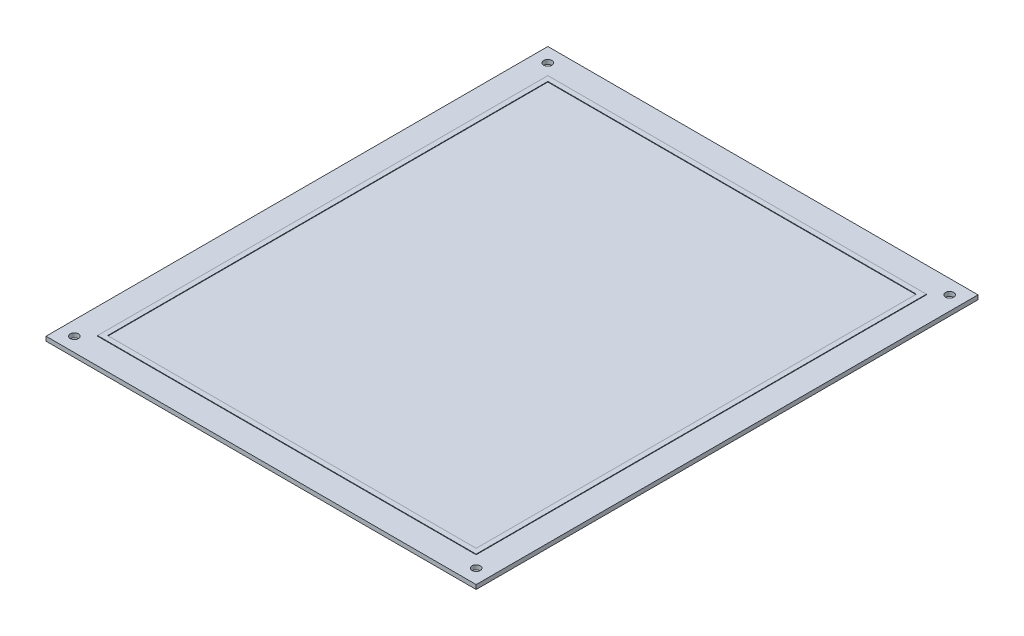
ISO-10303-21;
HEADER;
FILE_DESCRIPTION(('STEP AP214'),'2;1');
FILE_NAME('part.step','',(''),(''),'','','');
FILE_SCHEMA(('AUTOMOTIVE_DESIGN { 1 0 10303 214 1 1 1 1 }'));
ENDSEC;
DATA;
#1=APPLICATION_CONTEXT('core data for automotive mechanical design processes');
#2=APPLICATION_PROTOCOL_DEFINITION('international standard','automotive_design',2000,#1);
#3=PRODUCT_CONTEXT('',#1,'mechanical');
#4=PRODUCT('Part','Part','',(#3));
#5=PRODUCT_RELATED_PRODUCT_CATEGORY('part','',(#4));
#6=PRODUCT_DEFINITION_FORMATION('','',#4);
#7=PRODUCT_DEFINITION_CONTEXT('part definition',#1,'design');
#8=PRODUCT_DEFINITION('design','',#6,#7);
#9=PRODUCT_DEFINITION_SHAPE('','',#8);
#10=(LENGTH_UNIT() NAMED_UNIT(*) SI_UNIT(.MILLI.,.METRE.));
#11=(NAMED_UNIT(*) PLANE_ANGLE_UNIT() SI_UNIT($,.RADIAN.));
#12=(NAMED_UNIT(*) SI_UNIT($,.STERADIAN.) SOLID_ANGLE_UNIT());
#13=UNCERTAINTY_MEASURE_WITH_UNIT(LENGTH_MEASURE(1.E-05),#10,'distance_accuracy_value','');
#14=(GEOMETRIC_REPRESENTATION_CONTEXT(3) GLOBAL_UNCERTAINTY_ASSIGNED_CONTEXT((#13)) GLOBAL_UNIT_ASSIGNED_CONTEXT((#10,
#11,#12)) REPRESENTATION_CONTEXT('',''));
#15=CARTESIAN_POINT('',(0.,0.,0.));
#16=DIRECTION('',(0.,0.,1.));
#17=DIRECTION('',(1.,0.,0.));
#18=AXIS2_PLACEMENT_3D('',#15,#16,#17);
#19=CARTESIAN_POINT('',(0.,1.5,0.));
#20=DIRECTION('',(0.,-1.,0.));
#21=DIRECTION('',(0.,0.,-1.));
#22=AXIS2_PLACEMENT_3D('',#19,#20,#21);
#23=PLANE('',#22);
#24=DIRECTION('',(0.,0.,1.));
#25=VECTOR('',#24,1.);
#26=CARTESIAN_POINT('',(-150.,1.5,175.));
#27=LINE('',#26,#25);
#28=CARTESIAN_POINT('',(-150.,1.5,-175.));
#29=VERTEX_POINT('',#28);
#30=CARTESIAN_POINT('',(-150.,1.5,175.));
#31=VERTEX_POINT('',#30);
#32=EDGE_CURVE('E303',#29,#31,#27,.T.);
#33=ORIENTED_EDGE('',*,*,#32,.T.);
#34=DIRECTION('',(1.,0.,0.));
#35=VECTOR('',#34,1.);
#36=CARTESIAN_POINT('',(-150.,1.5,175.));
#37=LINE('',#36,#35);
#38=CARTESIAN_POINT('',(150.,1.5,175.));
#39=VERTEX_POINT('',#38);
#40=EDGE_CURVE('E306',#31,#39,#37,.T.);
#41=ORIENTED_EDGE('',*,*,#40,.T.);
#42=DIRECTION('',(0.,0.,-1.));
#43=VECTOR('',#42,1.);
#44=CARTESIAN_POINT('',(150.,1.5,175.));
#45=LINE('',#44,#43);
#46=CARTESIAN_POINT('',(150.,1.5,-175.));
#47=VERTEX_POINT('',#46);
#48=EDGE_CURVE('E309',#39,#47,#45,.T.);
#49=ORIENTED_EDGE('',*,*,#48,.T.);
#50=DIRECTION('',(-1.,0.,0.));
#51=VECTOR('',#50,1.);
#52=CARTESIAN_POINT('',(-150.,1.5,-175.));
#53=LINE('',#52,#51);
#54=EDGE_CURVE('E311',#47,#29,#53,.T.);
#55=ORIENTED_EDGE('',*,*,#54,.T.);
#56=EDGE_LOOP('',(#33,#41,#49,#55));
#57=FACE_BOUND('',#56,.T.);
#58=CARTESIAN_POINT('',(140.1,1.5,-165.1));
#59=DIRECTION('',(0.,1.,0.));
#60=DIRECTION('',(0.,0.,1.));
#61=AXIS2_PLACEMENT_3D('',#58,#59,#60);
#62=CIRCLE('',#61,2.88000000000001);
#63=CARTESIAN_POINT('',(140.1,1.5,-162.22));
#64=VERTEX_POINT('',#63);
#65=EDGE_CURVE('E297',#64,#64,#62,.T.);
#66=ORIENTED_EDGE('',*,*,#65,.F.);
#67=EDGE_LOOP('',(#66));
#68=FACE_BOUND('',#67,.T.);
#69=CARTESIAN_POINT('',(-140.1,1.5,-165.1));
#70=DIRECTION('',(0.,1.,0.));
#71=DIRECTION('',(0.,0.,1.));
#72=AXIS2_PLACEMENT_3D('',#69,#70,#71);
#73=CIRCLE('',#72,2.88000000000001);
#74=CARTESIAN_POINT('',(-140.1,1.5,-162.22));
#75=VERTEX_POINT('',#74);
#76=EDGE_CURVE('E291',#75,#75,#73,.T.);
#77=ORIENTED_EDGE('',*,*,#76,.F.);
#78=EDGE_LOOP('',(#77));
#79=FACE_BOUND('',#78,.T.);
#80=CARTESIAN_POINT('',(140.1,1.5,165.1));
#81=DIRECTION('',(0.,1.,0.));
#82=DIRECTION('',(0.,0.,1.));
#83=AXIS2_PLACEMENT_3D('',#80,#81,#82);
#84=CIRCLE('',#83,2.88000000000001);
#85=CARTESIAN_POINT('',(140.1,1.5,167.98));
#86=VERTEX_POINT('',#85);
#87=EDGE_CURVE('E285',#86,#86,#84,.T.);
#88=ORIENTED_EDGE('',*,*,#87,.F.);
#89=EDGE_LOOP('',(#88));
#90=FACE_BOUND('',#89,.T.);
#91=CARTESIAN_POINT('',(-140.1,1.5,165.1));
#92=DIRECTION('',(0.,1.,0.));
#93=DIRECTION('',(0.,0.,1.));
#94=AXIS2_PLACEMENT_3D('',#91,#92,#93);
#95=CIRCLE('',#94,2.88000000000001);
#96=CARTESIAN_POINT('',(-140.1,1.5,167.98));
#97=VERTEX_POINT('',#96);
#98=EDGE_CURVE('E279',#97,#97,#95,.T.);
#99=ORIENTED_EDGE('',*,*,#98,.F.);
#100=EDGE_LOOP('',(#99));
#101=FACE_BOUND('',#100,.T.);
#102=DIRECTION('',(0.,0.,1.));
#103=VECTOR('',#102,1.);
#104=CARTESIAN_POINT('',(-132.,1.5,0.));
#105=LINE('',#104,#103);
#106=CARTESIAN_POINT('',(-132.,1.5,-157.));
#107=VERTEX_POINT('',#106);
#108=CARTESIAN_POINT('',(-132.,1.5,157.));
#109=VERTEX_POINT('',#108);
#110=EDGE_CURVE('E276',#107,#109,#105,.T.);
#111=ORIENTED_EDGE('',*,*,#110,.F.);
#112=DIRECTION('',(-1.,0.,0.));
#113=VECTOR('',#112,1.);
#114=CARTESIAN_POINT('',(0.,1.5,-157.));
#115=LINE('',#114,#113);
#116=CARTESIAN_POINT('',(132.,1.5,-157.));
#117=VERTEX_POINT('',#116);
#118=EDGE_CURVE('E271',#117,#107,#115,.T.);
#119=ORIENTED_EDGE('',*,*,#118,.F.);
#120=DIRECTION('',(0.,0.,-1.));
#121=VECTOR('',#120,1.);
#122=CARTESIAN_POINT('',(132.,1.5,0.));
#123=LINE('',#122,#121);
#124=CARTESIAN_POINT('',(132.,1.5,157.));
#125=VERTEX_POINT('',#124);
#126=EDGE_CURVE('E59',#125,#117,#123,.T.);
#127=ORIENTED_EDGE('',*,*,#126,.F.);
#128=DIRECTION('',(1.,0.,0.));
#129=VECTOR('',#128,1.);
#130=CARTESIAN_POINT('',(0.,1.5,157.));
#131=LINE('',#130,#129);
#132=EDGE_CURVE('E54',#109,#125,#131,.T.);
#133=ORIENTED_EDGE('',*,*,#132,.F.);
#134=EDGE_LOOP('',(#111,#119,#127,#133));
#135=FACE_BOUND('',#134,.T.);
#136=ADVANCED_FACE('F39',(#57,#68,#79,#90,#101,#135),#23,.F.);
#137=CARTESIAN_POINT('',(0.,-1.5,0.));
#138=DIRECTION('',(0.,-1.,0.));
#139=DIRECTION('',(0.,0.,-1.));
#140=AXIS2_PLACEMENT_3D('',#137,#138,#139);
#141=PLANE('',#140);
#142=CARTESIAN_POINT('',(-140.1,-1.5,165.1));
#143=DIRECTION('',(0.,1.,0.));
#144=DIRECTION('',(0.,0.,1.));
#145=AXIS2_PLACEMENT_3D('',#142,#143,#144);
#146=CIRCLE('',#145,2.88000000000001);
#147=CARTESIAN_POINT('',(-140.1,-1.5,167.98));
#148=VERTEX_POINT('',#147);
#149=EDGE_CURVE('E278',#148,#148,#146,.T.);
#150=ORIENTED_EDGE('',*,*,#149,.T.);
#151=EDGE_LOOP('',(#150));
#152=FACE_BOUND('',#151,.T.);
#153=CARTESIAN_POINT('',(-140.1,-1.5,-165.1));
#154=DIRECTION('',(0.,1.,0.));
#155=DIRECTION('',(0.,0.,1.));
#156=AXIS2_PLACEMENT_3D('',#153,#154,#155);
#157=CIRCLE('',#156,2.88000000000001);
#158=CARTESIAN_POINT('',(-140.1,-1.5,-162.22));
#159=VERTEX_POINT('',#158);
#160=EDGE_CURVE('E288',#159,#159,#157,.T.);
#161=ORIENTED_EDGE('',*,*,#160,.T.);
#162=EDGE_LOOP('',(#161));
#163=FACE_BOUND('',#162,.T.);
#164=DIRECTION('',(0.,0.,1.));
#165=VECTOR('',#164,1.);
#166=CARTESIAN_POINT('',(-150.,-1.5,175.));
#167=LINE('',#166,#165);
#168=CARTESIAN_POINT('',(-150.,-1.5,-175.));
#169=VERTEX_POINT('',#168);
#170=CARTESIAN_POINT('',(-150.,-1.5,175.));
#171=VERTEX_POINT('',#170);
#172=EDGE_CURVE('E300',#169,#171,#167,.T.);
#173=ORIENTED_EDGE('',*,*,#172,.F.);
#174=DIRECTION('',(-1.,0.,0.));
#175=VECTOR('',#174,1.);
#176=CARTESIAN_POINT('',(-150.,-1.5,-175.));
#177=LINE('',#176,#175);
#178=CARTESIAN_POINT('',(150.,-1.5,-175.));
#179=VERTEX_POINT('',#178);
#180=EDGE_CURVE('E307',#179,#169,#177,.T.);
#181=ORIENTED_EDGE('',*,*,#180,.F.);
#182=DIRECTION('',(0.,0.,-1.));
#183=VECTOR('',#182,1.);
#184=CARTESIAN_POINT('',(150.,-1.5,175.));
#185=LINE('',#184,#183);
#186=CARTESIAN_POINT('',(150.,-1.5,175.));
#187=VERTEX_POINT('',#186);
#188=EDGE_CURVE('E318',#187,#179,#185,.T.);
#189=ORIENTED_EDGE('',*,*,#188,.F.);
#190=DIRECTION('',(1.,0.,0.));
#191=VECTOR('',#190,1.);
#192=CARTESIAN_POINT('',(-150.,-1.5,175.));
#193=LINE('',#192,#191);
#194=EDGE_CURVE('E316',#171,#187,#193,.T.);
#195=ORIENTED_EDGE('',*,*,#194,.F.);
#196=EDGE_LOOP('',(#173,#181,#189,#195));
#197=FACE_BOUND('',#196,.T.);
#198=CARTESIAN_POINT('',(140.1,-1.5,-165.1));
#199=DIRECTION('',(0.,1.,0.));
#200=DIRECTION('',(0.,0.,1.));
#201=AXIS2_PLACEMENT_3D('',#198,#199,#200);
#202=CIRCLE('',#201,2.88000000000001);
#203=CARTESIAN_POINT('',(140.1,-1.5,-162.22));
#204=VERTEX_POINT('',#203);
#205=EDGE_CURVE('E294',#204,#204,#202,.T.);
#206=ORIENTED_EDGE('',*,*,#205,.T.);
#207=EDGE_LOOP('',(#206));
#208=FACE_BOUND('',#207,.T.);
#209=CARTESIAN_POINT('',(140.1,-1.5,165.1));
#210=DIRECTION('',(0.,1.,0.));
#211=DIRECTION('',(0.,0.,1.));
#212=AXIS2_PLACEMENT_3D('',#209,#210,#211);
#213=CIRCLE('',#212,2.88000000000001);
#214=CARTESIAN_POINT('',(140.1,-1.5,167.98));
#215=VERTEX_POINT('',#214);
#216=EDGE_CURVE('E282',#215,#215,#213,.T.);
#217=ORIENTED_EDGE('',*,*,#216,.T.);
#218=EDGE_LOOP('',(#217));
#219=FACE_BOUND('',#218,.T.);
#220=DIRECTION('',(-1.,0.,0.));
#221=VECTOR('',#220,1.);
#222=CARTESIAN_POINT('',(0.,-1.5,-157.));
#223=LINE('',#222,#221);
#224=CARTESIAN_POINT('',(132.,-1.5,-157.));
#225=VERTEX_POINT('',#224);
#226=CARTESIAN_POINT('',(-132.,-1.5,-157.));
#227=VERTEX_POINT('',#226);
#228=EDGE_CURVE('E344',#225,#227,#223,.T.);
#229=ORIENTED_EDGE('',*,*,#228,.T.);
#230=DIRECTION('',(0.,0.,1.));
#231=VECTOR('',#230,1.);
#232=CARTESIAN_POINT('',(-132.,-1.5,0.));
#233=LINE('',#232,#231);
#234=CARTESIAN_POINT('',(-132.,-1.5,157.));
#235=VERTEX_POINT('',#234);
#236=EDGE_CURVE('E11',#227,#235,#233,.T.);
#237=ORIENTED_EDGE('',*,*,#236,.T.);
#238=DIRECTION('',(1.,0.,0.));
#239=VECTOR('',#238,1.);
#240=CARTESIAN_POINT('',(0.,-1.5,157.));
#241=LINE('',#240,#239);
#242=CARTESIAN_POINT('',(132.,-1.5,157.));
#243=VERTEX_POINT('',#242);
#244=EDGE_CURVE('E47',#235,#243,#241,.T.);
#245=ORIENTED_EDGE('',*,*,#244,.T.);
#246=DIRECTION('',(0.,0.,-1.));
#247=VECTOR('',#246,1.);
#248=CARTESIAN_POINT('',(132.,-1.5,0.));
#249=LINE('',#248,#247);
#250=EDGE_CURVE('E347',#243,#225,#249,.T.);
#251=ORIENTED_EDGE('',*,*,#250,.T.);
#252=EDGE_LOOP('',(#229,#237,#245,#251));
#253=FACE_BOUND('',#252,.T.);
#254=ADVANCED_FACE('F351',(#152,#163,#197,#208,#219,#253),#141,.T.);
#255=CARTESIAN_POINT('',(-150.,1.5,175.));
#256=DIRECTION('',(1.,0.,0.));
#257=DIRECTION('',(0.,0.,-1.));
#258=AXIS2_PLACEMENT_3D('',#255,#256,#257);
#259=PLANE('',#258);
#260=ORIENTED_EDGE('',*,*,#172,.T.);
#261=DIRECTION('',(0.,-1.,0.));
#262=VECTOR('',#261,1.);
#263=CARTESIAN_POINT('',(-150.,1.5,175.));
#264=LINE('',#263,#262);
#265=EDGE_CURVE('E329',#31,#171,#264,.T.);
#266=ORIENTED_EDGE('',*,*,#265,.F.);
#267=ORIENTED_EDGE('',*,*,#32,.F.);
#268=DIRECTION('',(0.,-1.,0.));
#269=VECTOR('',#268,1.);
#270=CARTESIAN_POINT('',(-150.,1.5,-175.));
#271=LINE('',#270,#269);
#272=EDGE_CURVE('E313',#29,#169,#271,.T.);
#273=ORIENTED_EDGE('',*,*,#272,.T.);
#274=EDGE_LOOP('',(#260,#266,#267,#273));
#275=FACE_BOUND('',#274,.T.);
#276=ADVANCED_FACE('F41',(#275),#259,.F.);
#277=CARTESIAN_POINT('',(-150.,1.5,175.));
#278=DIRECTION('',(0.,0.,-1.));
#279=DIRECTION('',(-1.,0.,0.));
#280=AXIS2_PLACEMENT_3D('',#277,#278,#279);
#281=PLANE('',#280);
#282=ORIENTED_EDGE('',*,*,#194,.T.);
#283=DIRECTION('',(0.,-1.,0.));
#284=VECTOR('',#283,1.);
#285=CARTESIAN_POINT('',(150.,1.5,175.));
#286=LINE('',#285,#284);
#287=EDGE_CURVE('E326',#39,#187,#286,.T.);
#288=ORIENTED_EDGE('',*,*,#287,.F.);
#289=ORIENTED_EDGE('',*,*,#40,.F.);
#290=ORIENTED_EDGE('',*,*,#265,.T.);
#291=EDGE_LOOP('',(#282,#288,#289,#290));
#292=FACE_BOUND('',#291,.T.);
#293=ADVANCED_FACE('F605',(#292),#281,.F.);
#294=CARTESIAN_POINT('',(150.,1.5,175.));
#295=DIRECTION('',(-1.,0.,0.));
#296=DIRECTION('',(0.,0.,1.));
#297=AXIS2_PLACEMENT_3D('',#294,#295,#296);
#298=PLANE('',#297);
#299=ORIENTED_EDGE('',*,*,#188,.T.);
#300=DIRECTION('',(0.,-1.,0.));
#301=VECTOR('',#300,1.);
#302=CARTESIAN_POINT('',(150.,1.5,-175.));
#303=LINE('',#302,#301);
#304=EDGE_CURVE('E323',#47,#179,#303,.T.);
#305=ORIENTED_EDGE('',*,*,#304,.F.);
#306=ORIENTED_EDGE('',*,*,#48,.F.);
#307=ORIENTED_EDGE('',*,*,#287,.T.);
#308=EDGE_LOOP('',(#299,#305,#306,#307));
#309=FACE_BOUND('',#308,.T.);
#310=ADVANCED_FACE('F596',(#309),#298,.F.);
#311=CARTESIAN_POINT('',(-150.,1.5,-175.));
#312=DIRECTION('',(0.,0.,1.));
#313=DIRECTION('',(1.,0.,0.));
#314=AXIS2_PLACEMENT_3D('',#311,#312,#313);
#315=PLANE('',#314);
#316=ORIENTED_EDGE('',*,*,#180,.T.);
#317=ORIENTED_EDGE('',*,*,#272,.F.);
#318=ORIENTED_EDGE('',*,*,#54,.F.);
#319=ORIENTED_EDGE('',*,*,#304,.T.);
#320=EDGE_LOOP('',(#316,#317,#318,#319));
#321=FACE_BOUND('',#320,.T.);
#322=ADVANCED_FACE('F588',(#321),#315,.F.);
#323=CARTESIAN_POINT('',(140.1,1.5,-165.1));
#324=DIRECTION('',(0.,-1.,0.));
#325=DIRECTION('',(0.,0.,-1.));
#326=AXIS2_PLACEMENT_3D('',#323,#324,#325);
#327=CYLINDRICAL_SURFACE('',#326,2.88000000000001);
#328=ORIENTED_EDGE('',*,*,#65,.T.);
#329=EDGE_LOOP('',(#328));
#330=FACE_BOUND('',#329,.T.);
#331=ORIENTED_EDGE('',*,*,#205,.F.);
#332=EDGE_LOOP('',(#331));
#333=FACE_BOUND('',#332,.T.);
#334=ADVANCED_FACE('F579',(#330,#333),#327,.F.);
#335=CARTESIAN_POINT('',(-140.1,1.5,-165.1));
#336=DIRECTION('',(0.,-1.,0.));
#337=DIRECTION('',(0.,0.,-1.));
#338=AXIS2_PLACEMENT_3D('',#335,#336,#337);
#339=CYLINDRICAL_SURFACE('',#338,2.88000000000001);
#340=ORIENTED_EDGE('',*,*,#76,.T.);
#341=EDGE_LOOP('',(#340));
#342=FACE_BOUND('',#341,.T.);
#343=ORIENTED_EDGE('',*,*,#160,.F.);
#344=EDGE_LOOP('',(#343));
#345=FACE_BOUND('',#344,.T.);
#346=ADVANCED_FACE('F570',(#342,#345),#339,.F.);
#347=CARTESIAN_POINT('',(140.1,1.5,165.1));
#348=DIRECTION('',(0.,-1.,0.));
#349=DIRECTION('',(0.,0.,-1.));
#350=AXIS2_PLACEMENT_3D('',#347,#348,#349);
#351=CYLINDRICAL_SURFACE('',#350,2.88000000000001);
#352=ORIENTED_EDGE('',*,*,#87,.T.);
#353=EDGE_LOOP('',(#352));
#354=FACE_BOUND('',#353,.T.);
#355=ORIENTED_EDGE('',*,*,#216,.F.);
#356=EDGE_LOOP('',(#355));
#357=FACE_BOUND('',#356,.T.);
#358=ADVANCED_FACE('F382',(#354,#357),#351,.F.);
#359=CARTESIAN_POINT('',(-140.1,1.5,165.1));
#360=DIRECTION('',(0.,-1.,0.));
#361=DIRECTION('',(0.,0.,-1.));
#362=AXIS2_PLACEMENT_3D('',#359,#360,#361);
#363=CYLINDRICAL_SURFACE('',#362,2.88000000000001);
#364=ORIENTED_EDGE('',*,*,#98,.T.);
#365=EDGE_LOOP('',(#364));
#366=FACE_BOUND('',#365,.T.);
#367=ORIENTED_EDGE('',*,*,#149,.F.);
#368=EDGE_LOOP('',(#367));
#369=FACE_BOUND('',#368,.T.);
#370=ADVANCED_FACE('F372',(#366,#369),#363,.F.);
#371=CARTESIAN_POINT('',(-132.,1.9,-157.));
#372=DIRECTION('',(0.,0.,1.));
#373=DIRECTION('',(1.,0.,0.));
#374=AXIS2_PLACEMENT_3D('',#371,#372,#373);
#375=PLANE('',#374);
#376=ORIENTED_EDGE('',*,*,#228,.F.);
#377=DIRECTION('',(0.,-1.,0.));
#378=VECTOR('',#377,1.);
#379=CARTESIAN_POINT('',(132.,1.9,-157.));
#380=LINE('',#379,#378);
#381=CARTESIAN_POINT('',(132.,-1.9,-157.));
#382=VERTEX_POINT('',#381);
#383=EDGE_CURVE('E250',#225,#382,#380,.T.);
#384=ORIENTED_EDGE('',*,*,#383,.T.);
#385=DIRECTION('',(-1.,0.,0.));
#386=VECTOR('',#385,1.);
#387=CARTESIAN_POINT('',(-132.,-1.9,-157.));
#388=LINE('',#387,#386);
#389=CARTESIAN_POINT('',(-132.,-1.9,-157.));
#390=VERTEX_POINT('',#389);
#391=EDGE_CURVE('E230',#382,#390,#388,.T.);
#392=ORIENTED_EDGE('',*,*,#391,.T.);
#393=DIRECTION('',(0.,-1.,0.));
#394=VECTOR('',#393,1.);
#395=CARTESIAN_POINT('',(-132.,1.9,-157.));
#396=LINE('',#395,#394);
#397=EDGE_CURVE('E236',#227,#390,#396,.T.);
#398=ORIENTED_EDGE('',*,*,#397,.F.);
#399=EDGE_LOOP('',(#376,#384,#392,#398));
#400=FACE_BOUND('',#399,.T.);
#401=ADVANCED_FACE('F370',(#400),#375,.F.);
#402=CARTESIAN_POINT('',(132.,1.9,157.));
#403=DIRECTION('',(-1.,0.,0.));
#404=DIRECTION('',(0.,0.,1.));
#405=AXIS2_PLACEMENT_3D('',#402,#403,#404);
#406=PLANE('',#405);
#407=ORIENTED_EDGE('',*,*,#250,.F.);
#408=DIRECTION('',(0.,-1.,0.));
#409=VECTOR('',#408,1.);
#410=CARTESIAN_POINT('',(132.,1.9,157.));
#411=LINE('',#410,#409);
#412=CARTESIAN_POINT('',(132.,-1.9,157.));
#413=VERTEX_POINT('',#412);
#414=EDGE_CURVE('E254',#243,#413,#411,.T.);
#415=ORIENTED_EDGE('',*,*,#414,.T.);
#416=DIRECTION('',(0.,0.,-1.));
#417=VECTOR('',#416,1.);
#418=CARTESIAN_POINT('',(132.,-1.9,157.));
#419=LINE('',#418,#417);
#420=EDGE_CURVE('E242',#413,#382,#419,.T.);
#421=ORIENTED_EDGE('',*,*,#420,.T.);
#422=ORIENTED_EDGE('',*,*,#383,.F.);
#423=EDGE_LOOP('',(#407,#415,#421,#422));
#424=FACE_BOUND('',#423,.T.);
#425=ADVANCED_FACE('F368',(#424),#406,.F.);
#426=CARTESIAN_POINT('',(-132.,1.9,157.));
#427=DIRECTION('',(0.,0.,-1.));
#428=DIRECTION('',(-1.,0.,0.));
#429=AXIS2_PLACEMENT_3D('',#426,#427,#428);
#430=PLANE('',#429);
#431=ORIENTED_EDGE('',*,*,#244,.F.);
#432=DIRECTION('',(0.,-1.,0.));
#433=VECTOR('',#432,1.);
#434=CARTESIAN_POINT('',(-132.,1.9,157.));
#435=LINE('',#434,#433);
#436=CARTESIAN_POINT('',(-132.,-1.9,157.));
#437=VERTEX_POINT('',#436);
#438=EDGE_CURVE('E258',#235,#437,#435,.T.);
#439=ORIENTED_EDGE('',*,*,#438,.T.);
#440=DIRECTION('',(1.,0.,0.));
#441=VECTOR('',#440,1.);
#442=CARTESIAN_POINT('',(-132.,-1.9,157.));
#443=LINE('',#442,#441);
#444=EDGE_CURVE('E239',#437,#413,#443,.T.);
#445=ORIENTED_EDGE('',*,*,#444,.T.);
#446=ORIENTED_EDGE('',*,*,#414,.F.);
#447=EDGE_LOOP('',(#431,#439,#445,#446));
#448=FACE_BOUND('',#447,.T.);
#449=ADVANCED_FACE('F356',(#448),#430,.F.);
#450=CARTESIAN_POINT('',(-132.,1.9,157.));
#451=DIRECTION('',(1.,0.,0.));
#452=DIRECTION('',(0.,0.,-1.));
#453=AXIS2_PLACEMENT_3D('',#450,#451,#452);
#454=PLANE('',#453);
#455=ORIENTED_EDGE('',*,*,#236,.F.);
#456=ORIENTED_EDGE('',*,*,#397,.T.);
#457=DIRECTION('',(0.,0.,1.));
#458=VECTOR('',#457,1.);
#459=CARTESIAN_POINT('',(-132.,-1.9,157.));
#460=LINE('',#459,#458);
#461=EDGE_CURVE('E194',#390,#437,#460,.T.);
#462=ORIENTED_EDGE('',*,*,#461,.T.);
#463=ORIENTED_EDGE('',*,*,#438,.F.);
#464=EDGE_LOOP('',(#455,#456,#462,#463));
#465=FACE_BOUND('',#464,.T.);
#466=ADVANCED_FACE('F359',(#465),#454,.F.);
#467=CARTESIAN_POINT('',(0.,-1.9,0.));
#468=DIRECTION('',(0.,-1.,0.));
#469=DIRECTION('',(0.,0.,-1.));
#470=AXIS2_PLACEMENT_3D('',#467,#468,#469);
#471=PLANE('',#470);
#472=ORIENTED_EDGE('',*,*,#461,.F.);
#473=ORIENTED_EDGE('',*,*,#391,.F.);
#474=ORIENTED_EDGE('',*,*,#420,.F.);
#475=ORIENTED_EDGE('',*,*,#444,.F.);
#476=EDGE_LOOP('',(#472,#473,#474,#475));
#477=FACE_BOUND('',#476,.T.);
#478=DIRECTION('',(-1.,0.,0.));
#479=VECTOR('',#478,1.);
#480=CARTESIAN_POINT('',(-128.5,-1.9,-153.5));
#481=LINE('',#480,#479);
#482=CARTESIAN_POINT('',(128.5,-1.9,-153.5));
#483=VERTEX_POINT('',#482);
#484=CARTESIAN_POINT('',(-128.5,-1.9,-153.5));
#485=VERTEX_POINT('',#484);
#486=EDGE_CURVE('E186',#483,#485,#481,.T.);
#487=ORIENTED_EDGE('',*,*,#486,.T.);
#488=DIRECTION('',(0.,0.,1.));
#489=VECTOR('',#488,1.);
#490=CARTESIAN_POINT('',(-128.5,-1.9,153.5));
#491=LINE('',#490,#489);
#492=CARTESIAN_POINT('',(-128.5,-1.9,153.5));
#493=VERTEX_POINT('',#492);
#494=EDGE_CURVE('E207',#485,#493,#491,.T.);
#495=ORIENTED_EDGE('',*,*,#494,.T.);
#496=DIRECTION('',(1.,0.,0.));
#497=VECTOR('',#496,1.);
#498=CARTESIAN_POINT('',(-128.5,-1.9,153.5));
#499=LINE('',#498,#497);
#500=CARTESIAN_POINT('',(128.5,-1.9,153.5));
#501=VERTEX_POINT('',#500);
#502=EDGE_CURVE('E210',#493,#501,#499,.T.);
#503=ORIENTED_EDGE('',*,*,#502,.T.);
#504=DIRECTION('',(0.,0.,-1.));
#505=VECTOR('',#504,1.);
#506=CARTESIAN_POINT('',(128.5,-1.9,153.5));
#507=LINE('',#506,#505);
#508=EDGE_CURVE('E213',#501,#483,#507,.T.);
#509=ORIENTED_EDGE('',*,*,#508,.T.);
#510=EDGE_LOOP('',(#487,#495,#503,#509));
#511=FACE_BOUND('',#510,.T.);
#512=ADVANCED_FACE('F363',(#477,#511),#471,.T.);
#513=CARTESIAN_POINT('',(-128.5,1.9,-153.5));
#514=DIRECTION('',(0.,0.,1.));
#515=DIRECTION('',(1.,0.,0.));
#516=AXIS2_PLACEMENT_3D('',#513,#514,#515);
#517=PLANE('',#516);
#518=DIRECTION('',(0.,-1.,0.));
#519=VECTOR('',#518,1.);
#520=CARTESIAN_POINT('',(128.5,1.9,-153.5));
#521=LINE('',#520,#519);
#522=CARTESIAN_POINT('',(128.5,-1.5,-153.5));
#523=VERTEX_POINT('',#522);
#524=EDGE_CURVE('E219',#523,#483,#521,.T.);
#525=ORIENTED_EDGE('',*,*,#524,.F.);
#526=DIRECTION('',(-1.,0.,0.));
#527=VECTOR('',#526,1.);
#528=CARTESIAN_POINT('',(0.,-1.5,-153.5));
#529=LINE('',#528,#527);
#530=CARTESIAN_POINT('',(-128.5,-1.5,-153.5));
#531=VERTEX_POINT('',#530);
#532=EDGE_CURVE('E332',#523,#531,#529,.T.);
#533=ORIENTED_EDGE('',*,*,#532,.T.);
#534=DIRECTION('',(0.,-1.,0.));
#535=VECTOR('',#534,1.);
#536=CARTESIAN_POINT('',(-128.5,1.9,-153.5));
#537=LINE('',#536,#535);
#538=EDGE_CURVE('E206',#531,#485,#537,.T.);
#539=ORIENTED_EDGE('',*,*,#538,.T.);
#540=ORIENTED_EDGE('',*,*,#486,.F.);
#541=EDGE_LOOP('',(#525,#533,#539,#540));
#542=FACE_BOUND('',#541,.T.);
#543=ADVANCED_FACE('F418',(#542),#517,.T.);
#544=CARTESIAN_POINT('',(128.5,1.9,153.5));
#545=DIRECTION('',(-1.,0.,0.));
#546=DIRECTION('',(0.,0.,1.));
#547=AXIS2_PLACEMENT_3D('',#544,#545,#546);
#548=PLANE('',#547);
#549=DIRECTION('',(0.,-1.,0.));
#550=VECTOR('',#549,1.);
#551=CARTESIAN_POINT('',(128.5,1.9,153.5));
#552=LINE('',#551,#550);
#553=CARTESIAN_POINT('',(128.5,-1.5,153.5));
#554=VERTEX_POINT('',#553);
#555=EDGE_CURVE('E223',#554,#501,#552,.T.);
#556=ORIENTED_EDGE('',*,*,#555,.F.);
#557=DIRECTION('',(0.,0.,-1.));
#558=VECTOR('',#557,1.);
#559=CARTESIAN_POINT('',(128.5,-1.5,0.));
#560=LINE('',#559,#558);
#561=EDGE_CURVE('E335',#554,#523,#560,.T.);
#562=ORIENTED_EDGE('',*,*,#561,.T.);
#563=ORIENTED_EDGE('',*,*,#524,.T.);
#564=ORIENTED_EDGE('',*,*,#508,.F.);
#565=EDGE_LOOP('',(#556,#562,#563,#564));
#566=FACE_BOUND('',#565,.T.);
#567=ADVANCED_FACE('F412',(#566),#548,.T.);
#568=CARTESIAN_POINT('',(-128.5,1.9,153.5));
#569=DIRECTION('',(0.,0.,-1.));
#570=DIRECTION('',(-1.,0.,0.));
#571=AXIS2_PLACEMENT_3D('',#568,#569,#570);
#572=PLANE('',#571);
#573=DIRECTION('',(0.,-1.,0.));
#574=VECTOR('',#573,1.);
#575=CARTESIAN_POINT('',(-128.5,1.9,153.5));
#576=LINE('',#575,#574);
#577=CARTESIAN_POINT('',(-128.5,-1.5,153.5));
#578=VERTEX_POINT('',#577);
#579=EDGE_CURVE('E195',#578,#493,#576,.T.);
#580=ORIENTED_EDGE('',*,*,#579,.F.);
#581=DIRECTION('',(1.,0.,0.));
#582=VECTOR('',#581,1.);
#583=CARTESIAN_POINT('',(0.,-1.5,153.5));
#584=LINE('',#583,#582);
#585=EDGE_CURVE('E338',#578,#554,#584,.T.);
#586=ORIENTED_EDGE('',*,*,#585,.T.);
#587=ORIENTED_EDGE('',*,*,#555,.T.);
#588=ORIENTED_EDGE('',*,*,#502,.F.);
#589=EDGE_LOOP('',(#580,#586,#587,#588));
#590=FACE_BOUND('',#589,.T.);
#591=ADVANCED_FACE('F420',(#590),#572,.T.);
#592=CARTESIAN_POINT('',(-128.5,1.9,153.5));
#593=DIRECTION('',(1.,0.,0.));
#594=DIRECTION('',(0.,0.,-1.));
#595=AXIS2_PLACEMENT_3D('',#592,#593,#594);
#596=PLANE('',#595);
#597=ORIENTED_EDGE('',*,*,#538,.F.);
#598=DIRECTION('',(0.,0.,1.));
#599=VECTOR('',#598,1.);
#600=CARTESIAN_POINT('',(-128.5,-1.5,0.));
#601=LINE('',#600,#599);
#602=EDGE_CURVE('E341',#531,#578,#601,.T.);
#603=ORIENTED_EDGE('',*,*,#602,.T.);
#604=ORIENTED_EDGE('',*,*,#579,.T.);
#605=ORIENTED_EDGE('',*,*,#494,.F.);
#606=EDGE_LOOP('',(#597,#603,#604,#605));
#607=FACE_BOUND('',#606,.T.);
#608=ADVANCED_FACE('F427',(#607),#596,.T.);
#609=ORIENTED_EDGE('',*,*,#602,.F.);
#610=ORIENTED_EDGE('',*,*,#532,.F.);
#611=ORIENTED_EDGE('',*,*,#561,.F.);
#612=ORIENTED_EDGE('',*,*,#585,.F.);
#613=EDGE_LOOP('',(#609,#610,#611,#612));
#614=FACE_BOUND('',#613,.T.);
#615=ADVANCED_FACE('F396',(#614),#141,.T.);
#616=CARTESIAN_POINT('',(-132.,1.9,-157.));
#617=VERTEX_POINT('',#616);
#618=EDGE_CURVE('E247',#617,#107,#396,.T.);
#619=ORIENTED_EDGE('',*,*,#618,.T.);
#620=ORIENTED_EDGE('',*,*,#110,.T.);
#621=CARTESIAN_POINT('',(-132.,1.9,157.));
#622=VERTEX_POINT('',#621);
#623=EDGE_CURVE('E259',#622,#109,#435,.T.);
#624=ORIENTED_EDGE('',*,*,#623,.F.);
#625=DIRECTION('',(0.,0.,1.));
#626=VECTOR('',#625,1.);
#627=CARTESIAN_POINT('',(-132.,1.9,157.));
#628=LINE('',#627,#626);
#629=EDGE_CURVE('E226',#617,#622,#628,.T.);
#630=ORIENTED_EDGE('',*,*,#629,.F.);
#631=EDGE_LOOP('',(#619,#620,#624,#630));
#632=FACE_BOUND('',#631,.T.);
#633=ADVANCED_FACE('F445',(#632),#454,.F.);
#634=ORIENTED_EDGE('',*,*,#623,.T.);
#635=ORIENTED_EDGE('',*,*,#132,.T.);
#636=CARTESIAN_POINT('',(132.,1.9,157.));
#637=VERTEX_POINT('',#636);
#638=EDGE_CURVE('E255',#637,#125,#411,.T.);
#639=ORIENTED_EDGE('',*,*,#638,.F.);
#640=DIRECTION('',(1.,0.,0.));
#641=VECTOR('',#640,1.);
#642=CARTESIAN_POINT('',(-132.,1.9,157.));
#643=LINE('',#642,#641);
#644=EDGE_CURVE('E229',#622,#637,#643,.T.);
#645=ORIENTED_EDGE('',*,*,#644,.F.);
#646=EDGE_LOOP('',(#634,#635,#639,#645));
#647=FACE_BOUND('',#646,.T.);
#648=ADVANCED_FACE('F491',(#647),#430,.F.);
#649=ORIENTED_EDGE('',*,*,#638,.T.);
#650=ORIENTED_EDGE('',*,*,#126,.T.);
#651=CARTESIAN_POINT('',(132.,1.9,-157.));
#652=VERTEX_POINT('',#651);
#653=EDGE_CURVE('E251',#652,#117,#380,.T.);
#654=ORIENTED_EDGE('',*,*,#653,.F.);
#655=DIRECTION('',(0.,0.,-1.));
#656=VECTOR('',#655,1.);
#657=CARTESIAN_POINT('',(132.,1.9,157.));
#658=LINE('',#657,#656);
#659=EDGE_CURVE('E232',#637,#652,#658,.T.);
#660=ORIENTED_EDGE('',*,*,#659,.F.);
#661=EDGE_LOOP('',(#649,#650,#654,#660));
#662=FACE_BOUND('',#661,.T.);
#663=ADVANCED_FACE('F380',(#662),#406,.F.);
#664=ORIENTED_EDGE('',*,*,#653,.T.);
#665=ORIENTED_EDGE('',*,*,#118,.T.);
#666=ORIENTED_EDGE('',*,*,#618,.F.);
#667=DIRECTION('',(-1.,0.,0.));
#668=VECTOR('',#667,1.);
#669=CARTESIAN_POINT('',(-132.,1.9,-157.));
#670=LINE('',#669,#668);
#671=EDGE_CURVE('E234',#652,#617,#670,.T.);
#672=ORIENTED_EDGE('',*,*,#671,.F.);
#673=EDGE_LOOP('',(#664,#665,#666,#672));
#674=FACE_BOUND('',#673,.T.);
#675=ADVANCED_FACE('F374',(#674),#375,.F.);
#676=DIRECTION('',(0.,0.,1.));
#677=VECTOR('',#676,1.);
#678=CARTESIAN_POINT('',(-128.5,1.5,0.));
#679=LINE('',#678,#677);
#680=CARTESIAN_POINT('',(-128.5,1.5,-153.5));
#681=VERTEX_POINT('',#680);
#682=CARTESIAN_POINT('',(-128.5,1.5,153.5));
#683=VERTEX_POINT('',#682);
#684=EDGE_CURVE('E269',#681,#683,#679,.T.);
#685=ORIENTED_EDGE('',*,*,#684,.F.);
#686=CARTESIAN_POINT('',(-128.5,1.9,-153.5));
#687=VERTEX_POINT('',#686);
#688=EDGE_CURVE('E181',#687,#681,#537,.T.);
#689=ORIENTED_EDGE('',*,*,#688,.F.);
#690=DIRECTION('',(0.,0.,1.));
#691=VECTOR('',#690,1.);
#692=CARTESIAN_POINT('',(-128.5,1.9,153.5));
#693=LINE('',#692,#691);
#694=CARTESIAN_POINT('',(-128.5,1.9,153.5));
#695=VERTEX_POINT('',#694);
#696=EDGE_CURVE('E175',#687,#695,#693,.T.);
#697=ORIENTED_EDGE('',*,*,#696,.T.);
#698=EDGE_CURVE('E179',#695,#683,#576,.T.);
#699=ORIENTED_EDGE('',*,*,#698,.T.);
#700=EDGE_LOOP('',(#685,#689,#697,#699));
#701=FACE_BOUND('',#700,.T.);
#702=ADVANCED_FACE('F178',(#701),#596,.T.);
#703=DIRECTION('',(1.,0.,0.));
#704=VECTOR('',#703,1.);
#705=CARTESIAN_POINT('',(0.,1.5,153.5));
#706=LINE('',#705,#704);
#707=CARTESIAN_POINT('',(128.5,1.5,153.5));
#708=VERTEX_POINT('',#707);
#709=EDGE_CURVE('E193',#683,#708,#706,.T.);
#710=ORIENTED_EDGE('',*,*,#709,.F.);
#711=ORIENTED_EDGE('',*,*,#698,.F.);
#712=DIRECTION('',(1.,0.,0.));
#713=VECTOR('',#712,1.);
#714=CARTESIAN_POINT('',(-128.5,1.9,153.5));
#715=LINE('',#714,#713);
#716=CARTESIAN_POINT('',(128.5,1.9,153.5));
#717=VERTEX_POINT('',#716);
#718=EDGE_CURVE('E185',#695,#717,#715,.T.);
#719=ORIENTED_EDGE('',*,*,#718,.T.);
#720=EDGE_CURVE('E224',#717,#708,#552,.T.);
#721=ORIENTED_EDGE('',*,*,#720,.T.);
#722=EDGE_LOOP('',(#710,#711,#719,#721));
#723=FACE_BOUND('',#722,.T.);
#724=ADVANCED_FACE('F189',(#723),#572,.T.);
#725=DIRECTION('',(0.,0.,-1.));
#726=VECTOR('',#725,1.);
#727=CARTESIAN_POINT('',(128.5,1.5,0.));
#728=LINE('',#727,#726);
#729=CARTESIAN_POINT('',(128.5,1.5,-153.5));
#730=VERTEX_POINT('',#729);
#731=EDGE_CURVE('E265',#708,#730,#728,.T.);
#732=ORIENTED_EDGE('',*,*,#731,.F.);
#733=ORIENTED_EDGE('',*,*,#720,.F.);
#734=DIRECTION('',(0.,0.,-1.));
#735=VECTOR('',#734,1.);
#736=CARTESIAN_POINT('',(128.5,1.9,153.5));
#737=LINE('',#736,#735);
#738=CARTESIAN_POINT('',(128.5,1.9,-153.5));
#739=VERTEX_POINT('',#738);
#740=EDGE_CURVE('E200',#717,#739,#737,.T.);
#741=ORIENTED_EDGE('',*,*,#740,.T.);
#742=EDGE_CURVE('E220',#739,#730,#521,.T.);
#743=ORIENTED_EDGE('',*,*,#742,.T.);
#744=EDGE_LOOP('',(#732,#733,#741,#743));
#745=FACE_BOUND('',#744,.T.);
#746=ADVANCED_FACE('F409',(#745),#548,.T.);
#747=DIRECTION('',(-1.,0.,0.));
#748=VECTOR('',#747,1.);
#749=CARTESIAN_POINT('',(0.,1.5,-153.5));
#750=LINE('',#749,#748);
#751=EDGE_CURVE('E262',#730,#681,#750,.T.);
#752=ORIENTED_EDGE('',*,*,#751,.F.);
#753=ORIENTED_EDGE('',*,*,#742,.F.);
#754=DIRECTION('',(-1.,0.,0.));
#755=VECTOR('',#754,1.);
#756=CARTESIAN_POINT('',(-128.5,1.9,-153.5));
#757=LINE('',#756,#755);
#758=EDGE_CURVE('E202',#739,#687,#757,.T.);
#759=ORIENTED_EDGE('',*,*,#758,.T.);
#760=ORIENTED_EDGE('',*,*,#688,.T.);
#761=EDGE_LOOP('',(#752,#753,#759,#760));
#762=FACE_BOUND('',#761,.T.);
#763=ADVANCED_FACE('F404',(#762),#517,.T.);
#764=CARTESIAN_POINT('',(0.,1.9,0.));
#765=DIRECTION('',(0.,-1.,0.));
#766=DIRECTION('',(0.,0.,-1.));
#767=AXIS2_PLACEMENT_3D('',#764,#765,#766);
#768=PLANE('',#767);
#769=ORIENTED_EDGE('',*,*,#629,.T.);
#770=ORIENTED_EDGE('',*,*,#644,.T.);
#771=ORIENTED_EDGE('',*,*,#659,.T.);
#772=ORIENTED_EDGE('',*,*,#671,.T.);
#773=EDGE_LOOP('',(#769,#770,#771,#772));
#774=FACE_BOUND('',#773,.T.);
#775=ORIENTED_EDGE('',*,*,#696,.F.);
#776=ORIENTED_EDGE('',*,*,#758,.F.);
#777=ORIENTED_EDGE('',*,*,#740,.F.);
#778=ORIENTED_EDGE('',*,*,#718,.F.);
#779=EDGE_LOOP('',(#775,#776,#777,#778));
#780=FACE_BOUND('',#779,.T.);
#781=ADVANCED_FACE('F198',(#774,#780),#768,.F.);
#782=ORIENTED_EDGE('',*,*,#751,.T.);
#783=ORIENTED_EDGE('',*,*,#684,.T.);
#784=ORIENTED_EDGE('',*,*,#709,.T.);
#785=ORIENTED_EDGE('',*,*,#731,.T.);
#786=EDGE_LOOP('',(#782,#783,#784,#785));
#787=FACE_BOUND('',#786,.T.);
#788=ADVANCED_FACE('F391',(#787),#23,.F.);
#789=CLOSED_SHELL('',(#136,#254,#276,#293,#310,#322,#334,#346,#358,#370,#401,#425,#449,#466,
#512,#543,#567,#591,#608,#615,#633,#648,#663,#675,#702,#724,#746,#763,#781,#788));
#790=MANIFOLD_SOLID_BREP('B2',#789);
#791=ADVANCED_BREP_SHAPE_REPRESENTATION('',(#18,#790),#14);
#792=SHAPE_DEFINITION_REPRESENTATION(#9,#791);
ENDSEC;
END-ISO-10303-21;
